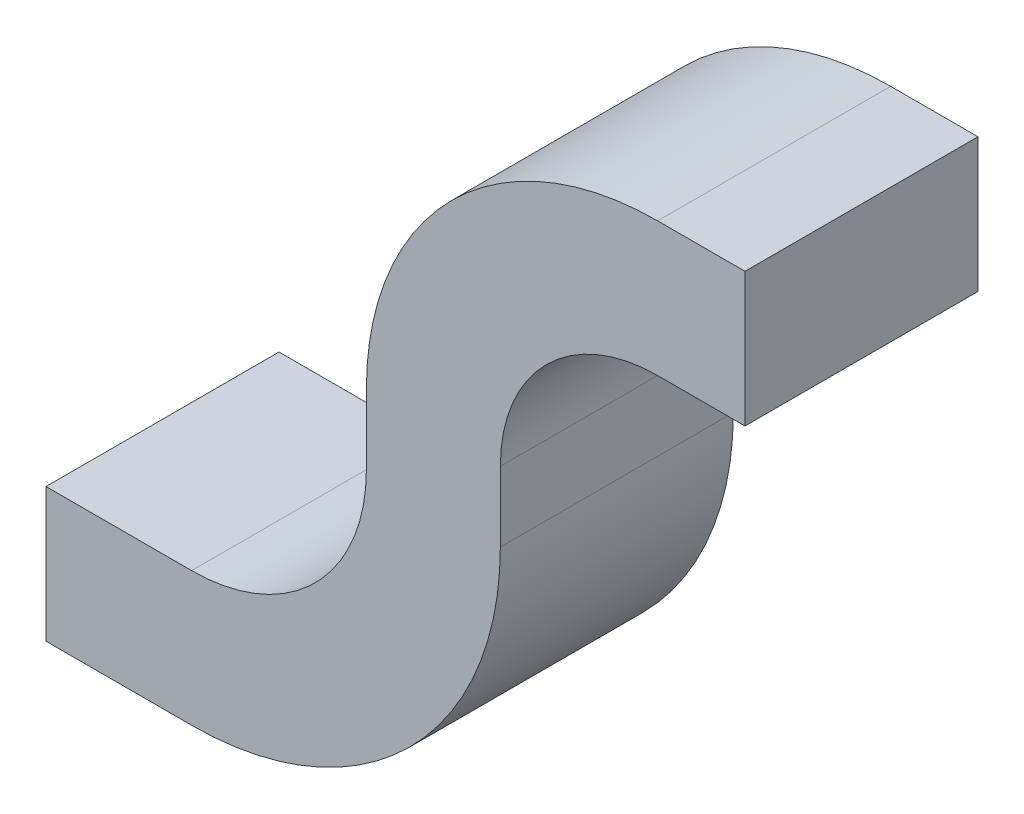
ISO-10303-21;
HEADER;
FILE_DESCRIPTION(('STEP AP214'),'2;1');
FILE_NAME('part.step','',(''),(''),'','','');
FILE_SCHEMA(('AUTOMOTIVE_DESIGN { 1 0 10303 214 1 1 1 1 }'));
ENDSEC;
DATA;
#1=APPLICATION_CONTEXT('core data for automotive mechanical design processes');
#2=APPLICATION_PROTOCOL_DEFINITION('international standard','automotive_design',2000,#1);
#3=PRODUCT_CONTEXT('',#1,'mechanical');
#4=PRODUCT('Part','Part','',(#3));
#5=PRODUCT_RELATED_PRODUCT_CATEGORY('part','',(#4));
#6=PRODUCT_DEFINITION_FORMATION('','',#4);
#7=PRODUCT_DEFINITION_CONTEXT('part definition',#1,'design');
#8=PRODUCT_DEFINITION('design','',#6,#7);
#9=PRODUCT_DEFINITION_SHAPE('','',#8);
#10=(LENGTH_UNIT() NAMED_UNIT(*) SI_UNIT(.MILLI.,.METRE.));
#11=(NAMED_UNIT(*) PLANE_ANGLE_UNIT() SI_UNIT($,.RADIAN.));
#12=(NAMED_UNIT(*) SI_UNIT($,.STERADIAN.) SOLID_ANGLE_UNIT());
#13=UNCERTAINTY_MEASURE_WITH_UNIT(LENGTH_MEASURE(1.E-05),#10,'distance_accuracy_value','');
#14=(GEOMETRIC_REPRESENTATION_CONTEXT(3) GLOBAL_UNCERTAINTY_ASSIGNED_CONTEXT((#13)) GLOBAL_UNIT_ASSIGNED_CONTEXT((#10,
#11,#12)) REPRESENTATION_CONTEXT('',''));
#15=CARTESIAN_POINT('',(0.,0.,0.));
#16=DIRECTION('',(0.,0.,1.));
#17=DIRECTION('',(1.,0.,0.));
#18=AXIS2_PLACEMENT_3D('',#15,#16,#17);
#19=CARTESIAN_POINT('',(0.25,0.53,0.));
#20=DIRECTION('',(0.,0.,1.));
#21=DIRECTION('',(1.,0.,0.));
#22=AXIS2_PLACEMENT_3D('',#19,#20,#21);
#23=PLANE('',#22);
#24=DIRECTION('',(0.,-1.,0.));
#25=VECTOR('',#24,1.);
#26=CARTESIAN_POINT('',(0.,0.,0.));
#27=LINE('',#26,#25);
#28=CARTESIAN_POINT('',(0.,0.23,0.));
#29=VERTEX_POINT('',#28);
#30=CARTESIAN_POINT('',(0.,0.,0.));
#31=VERTEX_POINT('',#30);
#32=EDGE_CURVE('E240',#29,#31,#27,.T.);
#33=ORIENTED_EDGE('',*,*,#32,.F.);
#34=DIRECTION('',(-1.,0.,0.));
#35=VECTOR('',#34,1.);
#36=CARTESIAN_POINT('',(0.,0.23,0.));
#37=LINE('',#36,#35);
#38=CARTESIAN_POINT('',(0.25,0.23,0.));
#39=VERTEX_POINT('',#38);
#40=EDGE_CURVE('E27',#39,#29,#37,.T.);
#41=ORIENTED_EDGE('',*,*,#40,.F.);
#42=CARTESIAN_POINT('',(0.25,0.53,0.));
#43=DIRECTION('',(0.,0.,-1.));
#44=DIRECTION('',(1.,0.,0.));
#45=AXIS2_PLACEMENT_3D('',#42,#43,#44);
#46=CIRCLE('',#45,0.3);
#47=CARTESIAN_POINT('',(0.55,0.53,0.));
#48=VERTEX_POINT('',#47);
#49=EDGE_CURVE('E192',#48,#39,#46,.T.);
#50=ORIENTED_EDGE('',*,*,#49,.F.);
#51=DIRECTION('',(0.,-1.,0.));
#52=VECTOR('',#51,1.);
#53=CARTESIAN_POINT('',(0.55,0.65,0.));
#54=LINE('',#53,#52);
#55=CARTESIAN_POINT('',(0.55,0.65,0.));
#56=VERTEX_POINT('',#55);
#57=EDGE_CURVE('E186',#56,#48,#54,.T.);
#58=ORIENTED_EDGE('',*,*,#57,.F.);
#59=CARTESIAN_POINT('',(1.05,0.65,0.));
#60=DIRECTION('',(0.,0.,1.));
#61=DIRECTION('',(-1.,0.,0.));
#62=AXIS2_PLACEMENT_3D('',#59,#60,#61);
#63=CIRCLE('',#62,0.5);
#64=CARTESIAN_POINT('',(1.05,1.15,0.));
#65=VERTEX_POINT('',#64);
#66=EDGE_CURVE('E168',#65,#56,#63,.T.);
#67=ORIENTED_EDGE('',*,*,#66,.F.);
#68=DIRECTION('',(-1.,0.,0.));
#69=VECTOR('',#68,1.);
#70=CARTESIAN_POINT('',(1.2,1.15,0.));
#71=LINE('',#70,#69);
#72=CARTESIAN_POINT('',(1.2,1.15,0.));
#73=VERTEX_POINT('',#72);
#74=EDGE_CURVE('E139',#73,#65,#71,.T.);
#75=ORIENTED_EDGE('',*,*,#74,.F.);
#76=DIRECTION('',(0.,1.,0.));
#77=VECTOR('',#76,1.);
#78=CARTESIAN_POINT('',(1.2,0.92,0.));
#79=LINE('',#78,#77);
#80=CARTESIAN_POINT('',(1.2,0.92,0.));
#81=VERTEX_POINT('',#80);
#82=EDGE_CURVE('E150',#81,#73,#79,.T.);
#83=ORIENTED_EDGE('',*,*,#82,.F.);
#84=DIRECTION('',(1.,0.,0.));
#85=VECTOR('',#84,1.);
#86=CARTESIAN_POINT('',(1.05,0.92,0.));
#87=LINE('',#86,#85);
#88=CARTESIAN_POINT('',(1.05,0.92,0.));
#89=VERTEX_POINT('',#88);
#90=EDGE_CURVE('E153',#89,#81,#87,.T.);
#91=ORIENTED_EDGE('',*,*,#90,.F.);
#92=CARTESIAN_POINT('',(1.05,0.65,0.));
#93=DIRECTION('',(0.,0.,-1.));
#94=DIRECTION('',(-1.,0.,0.));
#95=AXIS2_PLACEMENT_3D('',#92,#93,#94);
#96=CIRCLE('',#95,0.27);
#97=CARTESIAN_POINT('',(0.78,0.65,0.));
#98=VERTEX_POINT('',#97);
#99=EDGE_CURVE('E227',#98,#89,#96,.T.);
#100=ORIENTED_EDGE('',*,*,#99,.F.);
#101=DIRECTION('',(0.,1.,0.));
#102=VECTOR('',#101,1.);
#103=CARTESIAN_POINT('',(0.78,0.65,0.));
#104=LINE('',#103,#102);
#105=CARTESIAN_POINT('',(0.78,0.53,0.));
#106=VERTEX_POINT('',#105);
#107=EDGE_CURVE('E170',#106,#98,#104,.T.);
#108=ORIENTED_EDGE('',*,*,#107,.F.);
#109=CARTESIAN_POINT('',(0.25,0.53,0.));
#110=DIRECTION('',(0.,0.,1.));
#111=DIRECTION('',(-1.,0.,0.));
#112=AXIS2_PLACEMENT_3D('',#109,#110,#111);
#113=CIRCLE('',#112,0.53);
#114=CARTESIAN_POINT('',(0.25,0.,0.));
#115=VERTEX_POINT('',#114);
#116=EDGE_CURVE('E176',#115,#106,#113,.T.);
#117=ORIENTED_EDGE('',*,*,#116,.F.);
#118=DIRECTION('',(1.,0.,0.));
#119=VECTOR('',#118,1.);
#120=CARTESIAN_POINT('',(0.,0.,0.));
#121=LINE('',#120,#119);
#122=EDGE_CURVE('E208',#31,#115,#121,.T.);
#123=ORIENTED_EDGE('',*,*,#122,.F.);
#124=EDGE_LOOP('',(#33,#41,#50,#58,#67,#75,#83,#91,#100,#108,#117,#123));
#125=FACE_BOUND('',#124,.T.);
#126=ADVANCED_FACE('F16',(#125),#23,.F.);
#127=CARTESIAN_POINT('',(0.25,0.53,0.4));
#128=DIRECTION('',(0.,0.,1.));
#129=DIRECTION('',(1.,0.,0.));
#130=AXIS2_PLACEMENT_3D('',#127,#128,#129);
#131=PLANE('',#130);
#132=DIRECTION('',(0.,-1.,0.));
#133=VECTOR('',#132,1.);
#134=CARTESIAN_POINT('',(0.,0.,0.4));
#135=LINE('',#134,#133);
#136=CARTESIAN_POINT('',(0.,0.23,0.4));
#137=VERTEX_POINT('',#136);
#138=CARTESIAN_POINT('',(0.,0.,0.4));
#139=VERTEX_POINT('',#138);
#140=EDGE_CURVE('E219',#137,#139,#135,.T.);
#141=ORIENTED_EDGE('',*,*,#140,.T.);
#142=DIRECTION('',(1.,0.,0.));
#143=VECTOR('',#142,1.);
#144=CARTESIAN_POINT('',(0.,0.,0.4));
#145=LINE('',#144,#143);
#146=CARTESIAN_POINT('',(0.25,0.,0.4));
#147=VERTEX_POINT('',#146);
#148=EDGE_CURVE('E181',#139,#147,#145,.T.);
#149=ORIENTED_EDGE('',*,*,#148,.T.);
#150=CARTESIAN_POINT('',(0.25,0.53,0.4));
#151=DIRECTION('',(0.,0.,1.));
#152=DIRECTION('',(-1.,0.,0.));
#153=AXIS2_PLACEMENT_3D('',#150,#151,#152);
#154=CIRCLE('',#153,0.53);
#155=CARTESIAN_POINT('',(0.78,0.53,0.4));
#156=VERTEX_POINT('',#155);
#157=EDGE_CURVE('E175',#147,#156,#154,.T.);
#158=ORIENTED_EDGE('',*,*,#157,.T.);
#159=DIRECTION('',(0.,1.,0.));
#160=VECTOR('',#159,1.);
#161=CARTESIAN_POINT('',(0.78,0.65,0.4));
#162=LINE('',#161,#160);
#163=CARTESIAN_POINT('',(0.78,0.65,0.4));
#164=VERTEX_POINT('',#163);
#165=EDGE_CURVE('E226',#156,#164,#162,.T.);
#166=ORIENTED_EDGE('',*,*,#165,.T.);
#167=CARTESIAN_POINT('',(1.05,0.65,0.4));
#168=DIRECTION('',(0.,0.,-1.));
#169=DIRECTION('',(-1.,0.,0.));
#170=AXIS2_PLACEMENT_3D('',#167,#168,#169);
#171=CIRCLE('',#170,0.27);
#172=CARTESIAN_POINT('',(1.05,0.92,0.4));
#173=VERTEX_POINT('',#172);
#174=EDGE_CURVE('E20',#164,#173,#171,.T.);
#175=ORIENTED_EDGE('',*,*,#174,.T.);
#176=DIRECTION('',(1.,0.,0.));
#177=VECTOR('',#176,1.);
#178=CARTESIAN_POINT('',(1.05,0.92,0.4));
#179=LINE('',#178,#177);
#180=CARTESIAN_POINT('',(1.2,0.92,0.4));
#181=VERTEX_POINT('',#180);
#182=EDGE_CURVE('E142',#173,#181,#179,.T.);
#183=ORIENTED_EDGE('',*,*,#182,.T.);
#184=DIRECTION('',(0.,1.,0.));
#185=VECTOR('',#184,1.);
#186=CARTESIAN_POINT('',(1.2,0.92,0.4));
#187=LINE('',#186,#185);
#188=CARTESIAN_POINT('',(1.2,1.15,0.4));
#189=VERTEX_POINT('',#188);
#190=EDGE_CURVE('E127',#181,#189,#187,.T.);
#191=ORIENTED_EDGE('',*,*,#190,.T.);
#192=DIRECTION('',(-1.,0.,0.));
#193=VECTOR('',#192,1.);
#194=CARTESIAN_POINT('',(1.2,1.15,0.4));
#195=LINE('',#194,#193);
#196=CARTESIAN_POINT('',(1.05,1.15,0.4));
#197=VERTEX_POINT('',#196);
#198=EDGE_CURVE('E165',#189,#197,#195,.T.);
#199=ORIENTED_EDGE('',*,*,#198,.T.);
#200=CARTESIAN_POINT('',(1.05,0.65,0.4));
#201=DIRECTION('',(0.,0.,1.));
#202=DIRECTION('',(-1.,0.,0.));
#203=AXIS2_PLACEMENT_3D('',#200,#201,#202);
#204=CIRCLE('',#203,0.5);
#205=CARTESIAN_POINT('',(0.55,0.65,0.4));
#206=VERTEX_POINT('',#205);
#207=EDGE_CURVE('E182',#197,#206,#204,.T.);
#208=ORIENTED_EDGE('',*,*,#207,.T.);
#209=DIRECTION('',(0.,-1.,0.));
#210=VECTOR('',#209,1.);
#211=CARTESIAN_POINT('',(0.55,0.65,0.4));
#212=LINE('',#211,#210);
#213=CARTESIAN_POINT('',(0.55,0.53,0.4));
#214=VERTEX_POINT('',#213);
#215=EDGE_CURVE('E188',#206,#214,#212,.T.);
#216=ORIENTED_EDGE('',*,*,#215,.T.);
#217=CARTESIAN_POINT('',(0.25,0.53,0.4));
#218=DIRECTION('',(0.,0.,-1.));
#219=DIRECTION('',(1.,0.,0.));
#220=AXIS2_PLACEMENT_3D('',#217,#218,#219);
#221=CIRCLE('',#220,0.3);
#222=CARTESIAN_POINT('',(0.25,0.23,0.4));
#223=VERTEX_POINT('',#222);
#224=EDGE_CURVE('E205',#214,#223,#221,.T.);
#225=ORIENTED_EDGE('',*,*,#224,.T.);
#226=DIRECTION('',(-1.,0.,0.));
#227=VECTOR('',#226,1.);
#228=CARTESIAN_POINT('',(0.,0.23,0.4));
#229=LINE('',#228,#227);
#230=EDGE_CURVE('E11',#223,#137,#229,.T.);
#231=ORIENTED_EDGE('',*,*,#230,.T.);
#232=EDGE_LOOP('',(#141,#149,#158,#166,#175,#183,#191,#199,#208,#216,#225,#231));
#233=FACE_BOUND('',#232,.T.);
#234=ADVANCED_FACE('F144',(#233),#131,.T.);
#235=CARTESIAN_POINT('',(0.,0.23,0.4));
#236=DIRECTION('',(0.,-1.,0.));
#237=DIRECTION('',(0.,0.,-1.));
#238=AXIS2_PLACEMENT_3D('',#235,#236,#237);
#239=PLANE('',#238);
#240=ORIENTED_EDGE('',*,*,#40,.T.);
#241=DIRECTION('',(0.,0.,-1.));
#242=VECTOR('',#241,1.);
#243=CARTESIAN_POINT('',(0.,0.23,0.4));
#244=LINE('',#243,#242);
#245=EDGE_CURVE('E212',#137,#29,#244,.T.);
#246=ORIENTED_EDGE('',*,*,#245,.F.);
#247=ORIENTED_EDGE('',*,*,#230,.F.);
#248=DIRECTION('',(0.,0.,-1.));
#249=VECTOR('',#248,1.);
#250=CARTESIAN_POINT('',(0.25,0.23,0.4));
#251=LINE('',#250,#249);
#252=EDGE_CURVE('E204',#223,#39,#251,.T.);
#253=ORIENTED_EDGE('',*,*,#252,.T.);
#254=EDGE_LOOP('',(#240,#246,#247,#253));
#255=FACE_BOUND('',#254,.T.);
#256=ADVANCED_FACE('F395',(#255),#239,.F.);
#257=CARTESIAN_POINT('',(0.25,0.53,0.4));
#258=DIRECTION('',(0.,0.,-1.));
#259=DIRECTION('',(-1.,0.,0.));
#260=AXIS2_PLACEMENT_3D('',#257,#258,#259);
#261=CYLINDRICAL_SURFACE('',#260,0.3);
#262=ORIENTED_EDGE('',*,*,#49,.T.);
#263=ORIENTED_EDGE('',*,*,#252,.F.);
#264=ORIENTED_EDGE('',*,*,#224,.F.);
#265=DIRECTION('',(0.,0.,-1.));
#266=VECTOR('',#265,1.);
#267=CARTESIAN_POINT('',(0.55,0.53,0.4));
#268=LINE('',#267,#266);
#269=EDGE_CURVE('E193',#214,#48,#268,.T.);
#270=ORIENTED_EDGE('',*,*,#269,.T.);
#271=EDGE_LOOP('',(#262,#263,#264,#270));
#272=FACE_BOUND('',#271,.T.);
#273=ADVANCED_FACE('F394',(#272),#261,.F.);
#274=CARTESIAN_POINT('',(0.55,0.65,0.4));
#275=DIRECTION('',(1.,0.,0.));
#276=DIRECTION('',(0.,1.,0.));
#277=AXIS2_PLACEMENT_3D('',#274,#275,#276);
#278=PLANE('',#277);
#279=ORIENTED_EDGE('',*,*,#57,.T.);
#280=ORIENTED_EDGE('',*,*,#269,.F.);
#281=ORIENTED_EDGE('',*,*,#215,.F.);
#282=DIRECTION('',(0.,0.,-1.));
#283=VECTOR('',#282,1.);
#284=CARTESIAN_POINT('',(0.55,0.65,0.4));
#285=LINE('',#284,#283);
#286=EDGE_CURVE('E187',#206,#56,#285,.T.);
#287=ORIENTED_EDGE('',*,*,#286,.T.);
#288=EDGE_LOOP('',(#279,#280,#281,#287));
#289=FACE_BOUND('',#288,.T.);
#290=ADVANCED_FACE('F390',(#289),#278,.F.);
#291=CARTESIAN_POINT('',(1.05,0.65,0.4));
#292=DIRECTION('',(0.,0.,-1.));
#293=DIRECTION('',(-1.,0.,0.));
#294=AXIS2_PLACEMENT_3D('',#291,#292,#293);
#295=CYLINDRICAL_SURFACE('',#294,0.5);
#296=ORIENTED_EDGE('',*,*,#66,.T.);
#297=ORIENTED_EDGE('',*,*,#286,.F.);
#298=ORIENTED_EDGE('',*,*,#207,.F.);
#299=DIRECTION('',(0.,0.,-1.));
#300=VECTOR('',#299,1.);
#301=CARTESIAN_POINT('',(1.05,1.15,0.4));
#302=LINE('',#301,#300);
#303=EDGE_CURVE('E169',#197,#65,#302,.T.);
#304=ORIENTED_EDGE('',*,*,#303,.T.);
#305=EDGE_LOOP('',(#296,#297,#298,#304));
#306=FACE_BOUND('',#305,.T.);
#307=ADVANCED_FACE('F18',(#306),#295,.T.);
#308=CARTESIAN_POINT('',(1.2,1.15,0.4));
#309=DIRECTION('',(0.,-1.,0.));
#310=DIRECTION('',(0.,0.,-1.));
#311=AXIS2_PLACEMENT_3D('',#308,#309,#310);
#312=PLANE('',#311);
#313=ORIENTED_EDGE('',*,*,#74,.T.);
#314=ORIENTED_EDGE('',*,*,#303,.F.);
#315=ORIENTED_EDGE('',*,*,#198,.F.);
#316=DIRECTION('',(0.,0.,-1.));
#317=VECTOR('',#316,1.);
#318=CARTESIAN_POINT('',(1.2,1.15,0.4));
#319=LINE('',#318,#317);
#320=EDGE_CURVE('E135',#189,#73,#319,.T.);
#321=ORIENTED_EDGE('',*,*,#320,.T.);
#322=EDGE_LOOP('',(#313,#314,#315,#321));
#323=FACE_BOUND('',#322,.T.);
#324=ADVANCED_FACE('F383',(#323),#312,.F.);
#325=CARTESIAN_POINT('',(1.2,0.92,0.4));
#326=DIRECTION('',(-1.,0.,0.));
#327=DIRECTION('',(0.,0.,1.));
#328=AXIS2_PLACEMENT_3D('',#325,#326,#327);
#329=PLANE('',#328);
#330=ORIENTED_EDGE('',*,*,#82,.T.);
#331=ORIENTED_EDGE('',*,*,#320,.F.);
#332=ORIENTED_EDGE('',*,*,#190,.F.);
#333=DIRECTION('',(0.,0.,-1.));
#334=VECTOR('',#333,1.);
#335=CARTESIAN_POINT('',(1.2,0.92,0.4));
#336=LINE('',#335,#334);
#337=EDGE_CURVE('E132',#181,#81,#336,.T.);
#338=ORIENTED_EDGE('',*,*,#337,.T.);
#339=EDGE_LOOP('',(#330,#331,#332,#338));
#340=FACE_BOUND('',#339,.T.);
#341=ADVANCED_FACE('F130',(#340),#329,.F.);
#342=CARTESIAN_POINT('',(1.05,0.92,0.4));
#343=DIRECTION('',(0.,1.,0.));
#344=DIRECTION('',(1.,0.,0.));
#345=AXIS2_PLACEMENT_3D('',#342,#343,#344);
#346=PLANE('',#345);
#347=ORIENTED_EDGE('',*,*,#90,.T.);
#348=ORIENTED_EDGE('',*,*,#337,.F.);
#349=ORIENTED_EDGE('',*,*,#182,.F.);
#350=DIRECTION('',(0.,0.,-1.));
#351=VECTOR('',#350,1.);
#352=CARTESIAN_POINT('',(1.05,0.92,0.4));
#353=LINE('',#352,#351);
#354=EDGE_CURVE('E231',#173,#89,#353,.T.);
#355=ORIENTED_EDGE('',*,*,#354,.T.);
#356=EDGE_LOOP('',(#347,#348,#349,#355));
#357=FACE_BOUND('',#356,.T.);
#358=ADVANCED_FACE('F152',(#357),#346,.F.);
#359=CARTESIAN_POINT('',(1.05,0.65,0.4));
#360=DIRECTION('',(0.,0.,-1.));
#361=DIRECTION('',(-1.,0.,0.));
#362=AXIS2_PLACEMENT_3D('',#359,#360,#361);
#363=CYLINDRICAL_SURFACE('',#362,0.27);
#364=ORIENTED_EDGE('',*,*,#99,.T.);
#365=ORIENTED_EDGE('',*,*,#354,.F.);
#366=ORIENTED_EDGE('',*,*,#174,.F.);
#367=DIRECTION('',(0.,0.,-1.));
#368=VECTOR('',#367,1.);
#369=CARTESIAN_POINT('',(0.78,0.65,0.4));
#370=LINE('',#369,#368);
#371=EDGE_CURVE('E174',#164,#98,#370,.T.);
#372=ORIENTED_EDGE('',*,*,#371,.T.);
#373=EDGE_LOOP('',(#364,#365,#366,#372));
#374=FACE_BOUND('',#373,.T.);
#375=ADVANCED_FACE('F265',(#374),#363,.F.);
#376=CARTESIAN_POINT('',(0.78,0.65,0.4));
#377=DIRECTION('',(-1.,0.,0.));
#378=DIRECTION('',(0.,0.,1.));
#379=AXIS2_PLACEMENT_3D('',#376,#377,#378);
#380=PLANE('',#379);
#381=ORIENTED_EDGE('',*,*,#107,.T.);
#382=ORIENTED_EDGE('',*,*,#371,.F.);
#383=ORIENTED_EDGE('',*,*,#165,.F.);
#384=DIRECTION('',(0.,0.,-1.));
#385=VECTOR('',#384,1.);
#386=CARTESIAN_POINT('',(0.78,0.53,0.4));
#387=LINE('',#386,#385);
#388=EDGE_CURVE('E180',#156,#106,#387,.T.);
#389=ORIENTED_EDGE('',*,*,#388,.T.);
#390=EDGE_LOOP('',(#381,#382,#383,#389));
#391=FACE_BOUND('',#390,.T.);
#392=ADVANCED_FACE('F263',(#391),#380,.F.);
#393=CARTESIAN_POINT('',(0.25,0.53,0.4));
#394=DIRECTION('',(0.,0.,-1.));
#395=DIRECTION('',(-1.,0.,0.));
#396=AXIS2_PLACEMENT_3D('',#393,#394,#395);
#397=CYLINDRICAL_SURFACE('',#396,0.53);
#398=ORIENTED_EDGE('',*,*,#116,.T.);
#399=ORIENTED_EDGE('',*,*,#388,.F.);
#400=ORIENTED_EDGE('',*,*,#157,.F.);
#401=DIRECTION('',(0.,0.,-1.));
#402=VECTOR('',#401,1.);
#403=CARTESIAN_POINT('',(0.25,0.,0.4));
#404=LINE('',#403,#402);
#405=EDGE_CURVE('E163',#147,#115,#404,.T.);
#406=ORIENTED_EDGE('',*,*,#405,.T.);
#407=EDGE_LOOP('',(#398,#399,#400,#406));
#408=FACE_BOUND('',#407,.T.);
#409=ADVANCED_FACE('F374',(#408),#397,.T.);
#410=CARTESIAN_POINT('',(0.,0.,0.4));
#411=DIRECTION('',(0.,1.,0.));
#412=DIRECTION('',(1.,0.,0.));
#413=AXIS2_PLACEMENT_3D('',#410,#411,#412);
#414=PLANE('',#413);
#415=ORIENTED_EDGE('',*,*,#122,.T.);
#416=ORIENTED_EDGE('',*,*,#405,.F.);
#417=ORIENTED_EDGE('',*,*,#148,.F.);
#418=DIRECTION('',(0.,0.,-1.));
#419=VECTOR('',#418,1.);
#420=CARTESIAN_POINT('',(0.,0.,0.4));
#421=LINE('',#420,#419);
#422=EDGE_CURVE('E222',#139,#31,#421,.T.);
#423=ORIENTED_EDGE('',*,*,#422,.T.);
#424=EDGE_LOOP('',(#415,#416,#417,#423));
#425=FACE_BOUND('',#424,.T.);
#426=ADVANCED_FACE('F376',(#425),#414,.F.);
#427=CARTESIAN_POINT('',(0.,0.,0.4));
#428=DIRECTION('',(1.,0.,0.));
#429=DIRECTION('',(0.,1.,0.));
#430=AXIS2_PLACEMENT_3D('',#427,#428,#429);
#431=PLANE('',#430);
#432=ORIENTED_EDGE('',*,*,#32,.T.);
#433=ORIENTED_EDGE('',*,*,#422,.F.);
#434=ORIENTED_EDGE('',*,*,#140,.F.);
#435=ORIENTED_EDGE('',*,*,#245,.T.);
#436=EDGE_LOOP('',(#432,#433,#434,#435));
#437=FACE_BOUND('',#436,.T.);
#438=ADVANCED_FACE('F398',(#437),#431,.F.);
#439=CLOSED_SHELL('',(#126,#234,#256,#273,#290,#307,#324,#341,#358,#375,#392,#409,#426,#438));
#440=MANIFOLD_SOLID_BREP('B1',#439);
#441=ADVANCED_BREP_SHAPE_REPRESENTATION('',(#18,#440),#14);
#442=SHAPE_DEFINITION_REPRESENTATION(#9,#441);
ENDSEC;
END-ISO-10303-21;
